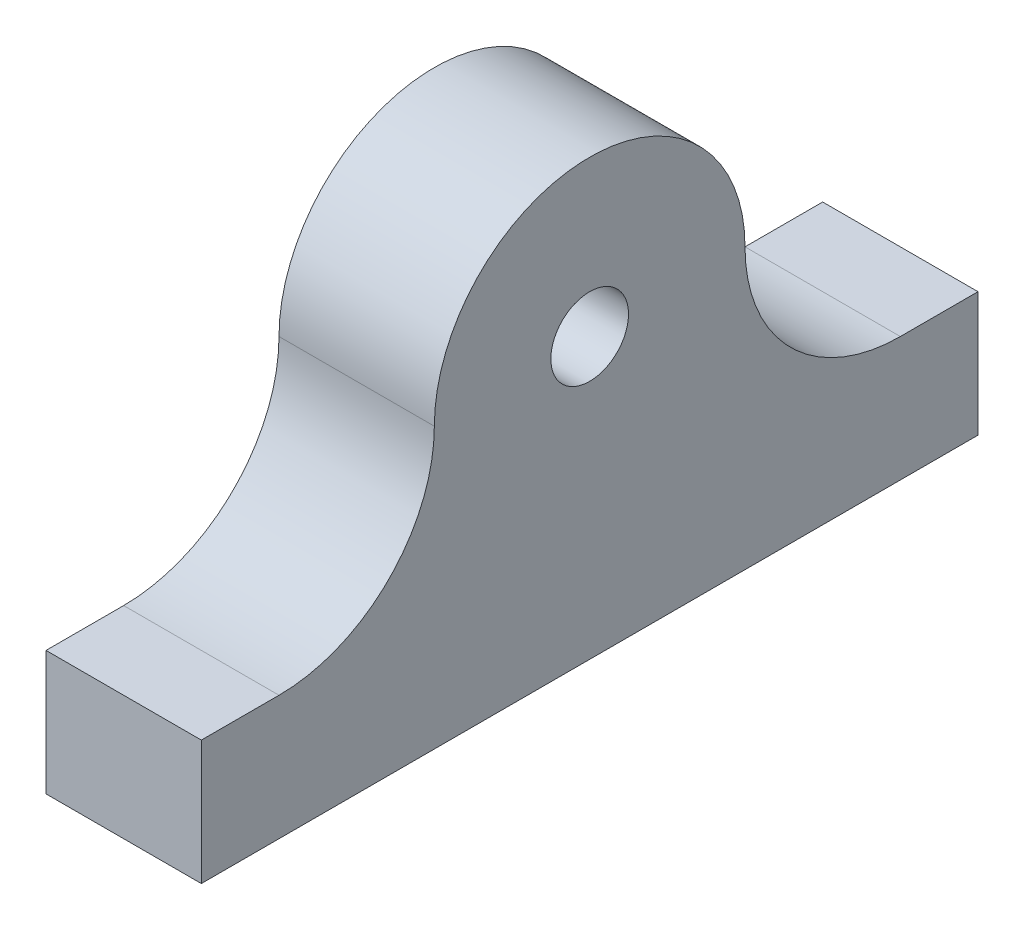
ISO-10303-21;
HEADER;
FILE_DESCRIPTION(('STEP AP214'),'2;1');
FILE_NAME('part.step','',(''),(''),'','','');
FILE_SCHEMA(('AUTOMOTIVE_DESIGN { 1 0 10303 214 1 1 1 1 }'));
ENDSEC;
DATA;
#1=APPLICATION_CONTEXT('core data for automotive mechanical design processes');
#2=APPLICATION_PROTOCOL_DEFINITION('international standard','automotive_design',2000,#1);
#3=PRODUCT_CONTEXT('',#1,'mechanical');
#4=PRODUCT('Part','Part','',(#3));
#5=PRODUCT_RELATED_PRODUCT_CATEGORY('part','',(#4));
#6=PRODUCT_DEFINITION_FORMATION('','',#4);
#7=PRODUCT_DEFINITION_CONTEXT('part definition',#1,'design');
#8=PRODUCT_DEFINITION('design','',#6,#7);
#9=PRODUCT_DEFINITION_SHAPE('','',#8);
#10=(LENGTH_UNIT() NAMED_UNIT(*) SI_UNIT(.MILLI.,.METRE.));
#11=(NAMED_UNIT(*) PLANE_ANGLE_UNIT() SI_UNIT($,.RADIAN.));
#12=(NAMED_UNIT(*) SI_UNIT($,.STERADIAN.) SOLID_ANGLE_UNIT());
#13=UNCERTAINTY_MEASURE_WITH_UNIT(LENGTH_MEASURE(1.E-05),#10,'distance_accuracy_value','');
#14=(GEOMETRIC_REPRESENTATION_CONTEXT(3) GLOBAL_UNCERTAINTY_ASSIGNED_CONTEXT((#13)) GLOBAL_UNIT_ASSIGNED_CONTEXT((#10,
#11,#12)) REPRESENTATION_CONTEXT('',''));
#15=CARTESIAN_POINT('',(0.,0.,0.));
#16=DIRECTION('',(0.,0.,1.));
#17=DIRECTION('',(1.,0.,0.));
#18=AXIS2_PLACEMENT_3D('',#15,#16,#17);
#19=CARTESIAN_POINT('',(10.,18.,0.));
#20=DIRECTION('',(1.,0.,0.));
#21=DIRECTION('',(0.,0.,-1.));
#22=AXIS2_PLACEMENT_3D('',#19,#20,#21);
#23=PLANE('',#22);
#24=DIRECTION('',(0.,-1.,0.));
#25=VECTOR('',#24,1.);
#26=CARTESIAN_POINT('',(10.,0.,25.));
#27=LINE('',#26,#25);
#28=CARTESIAN_POINT('',(10.,7.99999999999999,25.));
#29=VERTEX_POINT('',#28);
#30=CARTESIAN_POINT('',(10.,0.,25.));
#31=VERTEX_POINT('',#30);
#32=EDGE_CURVE('E111',#29,#31,#27,.T.);
#33=ORIENTED_EDGE('',*,*,#32,.T.);
#34=DIRECTION('',(0.,0.,-1.));
#35=VECTOR('',#34,1.);
#36=CARTESIAN_POINT('',(10.,0.,25.));
#37=LINE('',#36,#35);
#38=CARTESIAN_POINT('',(10.,0.,-25.));
#39=VERTEX_POINT('',#38);
#40=EDGE_CURVE('E101',#31,#39,#37,.T.);
#41=ORIENTED_EDGE('',*,*,#40,.T.);
#42=DIRECTION('',(0.,1.,0.));
#43=VECTOR('',#42,1.);
#44=CARTESIAN_POINT('',(10.,0.,-25.));
#45=LINE('',#44,#43);
#46=CARTESIAN_POINT('',(10.,8.,-25.));
#47=VERTEX_POINT('',#46);
#48=EDGE_CURVE('E110',#39,#47,#45,.T.);
#49=ORIENTED_EDGE('',*,*,#48,.T.);
#50=DIRECTION('',(0.,0.,1.));
#51=VECTOR('',#50,1.);
#52=CARTESIAN_POINT('',(10.,8.,-10.));
#53=LINE('',#52,#51);
#54=CARTESIAN_POINT('',(10.,8.,-20.));
#55=VERTEX_POINT('',#54);
#56=EDGE_CURVE('E167',#47,#55,#53,.T.);
#57=ORIENTED_EDGE('',*,*,#56,.T.);
#58=CARTESIAN_POINT('',(10.,18.,-20.));
#59=DIRECTION('',(1.,0.,0.));
#60=DIRECTION('',(0.,0.,-1.));
#61=AXIS2_PLACEMENT_3D('',#58,#59,#60);
#62=CIRCLE('',#61,10.);
#63=CARTESIAN_POINT('',(10.,18.,-10.));
#64=VERTEX_POINT('',#63);
#65=EDGE_CURVE('E135',#55,#64,#62,.F.);
#66=ORIENTED_EDGE('',*,*,#65,.T.);
#67=CARTESIAN_POINT('',(10.,18.,0.));
#68=DIRECTION('',(1.,0.,0.));
#69=DIRECTION('',(0.,0.,-1.));
#70=AXIS2_PLACEMENT_3D('',#67,#68,#69);
#71=CIRCLE('',#70,10.);
#72=CARTESIAN_POINT('',(10.,18.,10.));
#73=VERTEX_POINT('',#72);
#74=EDGE_CURVE('E184',#64,#73,#71,.T.);
#75=ORIENTED_EDGE('',*,*,#74,.T.);
#76=CARTESIAN_POINT('',(10.,18.,20.));
#77=DIRECTION('',(1.,0.,0.));
#78=DIRECTION('',(0.,0.,-1.));
#79=AXIS2_PLACEMENT_3D('',#76,#77,#78);
#80=CIRCLE('',#79,10.);
#81=CARTESIAN_POINT('',(10.,7.99999999999999,20.));
#82=VERTEX_POINT('',#81);
#83=EDGE_CURVE('E11',#73,#82,#80,.F.);
#84=ORIENTED_EDGE('',*,*,#83,.T.);
#85=DIRECTION('',(0.,0.,1.));
#86=VECTOR('',#85,1.);
#87=CARTESIAN_POINT('',(10.,7.99999999999999,25.));
#88=LINE('',#87,#86);
#89=EDGE_CURVE('E115',#82,#29,#88,.T.);
#90=ORIENTED_EDGE('',*,*,#89,.T.);
#91=EDGE_LOOP('',(#33,#41,#49,#57,#66,#75,#84,#90));
#92=FACE_BOUND('',#91,.T.);
#93=CARTESIAN_POINT('',(10.,18.,0.));
#94=DIRECTION('',(1.,0.,0.));
#95=DIRECTION('',(0.,0.,-1.));
#96=AXIS2_PLACEMENT_3D('',#93,#94,#95);
#97=CIRCLE('',#96,2.5);
#98=CARTESIAN_POINT('',(10.,18.,-2.5));
#99=VERTEX_POINT('',#98);
#100=EDGE_CURVE('E177',#99,#99,#97,.T.);
#101=ORIENTED_EDGE('',*,*,#100,.F.);
#102=EDGE_LOOP('',(#101));
#103=FACE_BOUND('',#102,.T.);
#104=ADVANCED_FACE('F38',(#92,#103),#23,.T.);
#105=CARTESIAN_POINT('',(0.,18.,0.));
#106=DIRECTION('',(1.,0.,0.));
#107=DIRECTION('',(0.,0.,-1.));
#108=AXIS2_PLACEMENT_3D('',#105,#106,#107);
#109=PLANE('',#108);
#110=DIRECTION('',(0.,-1.,0.));
#111=VECTOR('',#110,1.);
#112=CARTESIAN_POINT('',(0.,0.,25.));
#113=LINE('',#112,#111);
#114=CARTESIAN_POINT('',(0.,7.99999999999999,25.));
#115=VERTEX_POINT('',#114);
#116=CARTESIAN_POINT('',(0.,0.,25.));
#117=VERTEX_POINT('',#116);
#118=EDGE_CURVE('E123',#115,#117,#113,.T.);
#119=ORIENTED_EDGE('',*,*,#118,.F.);
#120=DIRECTION('',(0.,0.,1.));
#121=VECTOR('',#120,1.);
#122=CARTESIAN_POINT('',(0.,7.99999999999999,25.));
#123=LINE('',#122,#121);
#124=CARTESIAN_POINT('',(0.,7.99999999999999,20.));
#125=VERTEX_POINT('',#124);
#126=EDGE_CURVE('E119',#125,#115,#123,.T.);
#127=ORIENTED_EDGE('',*,*,#126,.F.);
#128=CARTESIAN_POINT('',(0.,18.,20.));
#129=DIRECTION('',(1.,0.,0.));
#130=DIRECTION('',(0.,0.,-1.));
#131=AXIS2_PLACEMENT_3D('',#128,#129,#130);
#132=CIRCLE('',#131,10.);
#133=CARTESIAN_POINT('',(0.,18.,10.));
#134=VERTEX_POINT('',#133);
#135=EDGE_CURVE('E46',#125,#134,#132,.T.);
#136=ORIENTED_EDGE('',*,*,#135,.T.);
#137=CARTESIAN_POINT('',(0.,18.,0.));
#138=DIRECTION('',(1.,0.,0.));
#139=DIRECTION('',(0.,0.,-1.));
#140=AXIS2_PLACEMENT_3D('',#137,#138,#139);
#141=CIRCLE('',#140,10.);
#142=CARTESIAN_POINT('',(0.,18.,-10.));
#143=VERTEX_POINT('',#142);
#144=EDGE_CURVE('E142',#143,#134,#141,.T.);
#145=ORIENTED_EDGE('',*,*,#144,.F.);
#146=CARTESIAN_POINT('',(0.,18.,-20.));
#147=DIRECTION('',(1.,0.,0.));
#148=DIRECTION('',(0.,0.,-1.));
#149=AXIS2_PLACEMENT_3D('',#146,#147,#148);
#150=CIRCLE('',#149,10.);
#151=CARTESIAN_POINT('',(0.,8.,-20.));
#152=VERTEX_POINT('',#151);
#153=EDGE_CURVE('E133',#143,#152,#150,.T.);
#154=ORIENTED_EDGE('',*,*,#153,.T.);
#155=DIRECTION('',(0.,0.,1.));
#156=VECTOR('',#155,1.);
#157=CARTESIAN_POINT('',(0.,8.,-10.));
#158=LINE('',#157,#156);
#159=CARTESIAN_POINT('',(0.,8.,-25.));
#160=VERTEX_POINT('',#159);
#161=EDGE_CURVE('E151',#160,#152,#158,.T.);
#162=ORIENTED_EDGE('',*,*,#161,.F.);
#163=DIRECTION('',(0.,1.,0.));
#164=VECTOR('',#163,1.);
#165=CARTESIAN_POINT('',(0.,0.,-25.));
#166=LINE('',#165,#164);
#167=CARTESIAN_POINT('',(0.,0.,-25.));
#168=VERTEX_POINT('',#167);
#169=EDGE_CURVE('E170',#168,#160,#166,.T.);
#170=ORIENTED_EDGE('',*,*,#169,.F.);
#171=DIRECTION('',(0.,0.,-1.));
#172=VECTOR('',#171,1.);
#173=CARTESIAN_POINT('',(0.,0.,25.));
#174=LINE('',#173,#172);
#175=EDGE_CURVE('E172',#117,#168,#174,.T.);
#176=ORIENTED_EDGE('',*,*,#175,.F.);
#177=EDGE_LOOP('',(#119,#127,#136,#145,#154,#162,#170,#176));
#178=FACE_BOUND('',#177,.T.);
#179=CARTESIAN_POINT('',(0.,18.,0.));
#180=DIRECTION('',(1.,0.,0.));
#181=DIRECTION('',(0.,0.,-1.));
#182=AXIS2_PLACEMENT_3D('',#179,#180,#181);
#183=CIRCLE('',#182,2.5);
#184=CARTESIAN_POINT('',(0.,18.,-2.5));
#185=VERTEX_POINT('',#184);
#186=EDGE_CURVE('E180',#185,#185,#183,.T.);
#187=ORIENTED_EDGE('',*,*,#186,.T.);
#188=EDGE_LOOP('',(#187));
#189=FACE_BOUND('',#188,.T.);
#190=ADVANCED_FACE('F140',(#178,#189),#109,.F.);
#191=CARTESIAN_POINT('',(10.,0.,25.));
#192=DIRECTION('',(0.,0.,-1.));
#193=DIRECTION('',(-1.,0.,0.));
#194=AXIS2_PLACEMENT_3D('',#191,#192,#193);
#195=PLANE('',#194);
#196=ORIENTED_EDGE('',*,*,#118,.T.);
#197=DIRECTION('',(-1.,0.,0.));
#198=VECTOR('',#197,1.);
#199=CARTESIAN_POINT('',(10.,0.,25.));
#200=LINE('',#199,#198);
#201=EDGE_CURVE('E105',#31,#117,#200,.T.);
#202=ORIENTED_EDGE('',*,*,#201,.F.);
#203=ORIENTED_EDGE('',*,*,#32,.F.);
#204=DIRECTION('',(-1.,0.,0.));
#205=VECTOR('',#204,1.);
#206=CARTESIAN_POINT('',(10.,7.99999999999999,25.));
#207=LINE('',#206,#205);
#208=EDGE_CURVE('E153',#29,#115,#207,.T.);
#209=ORIENTED_EDGE('',*,*,#208,.T.);
#210=EDGE_LOOP('',(#196,#202,#203,#209));
#211=FACE_BOUND('',#210,.T.);
#212=ADVANCED_FACE('F121',(#211),#195,.F.);
#213=CARTESIAN_POINT('',(10.,0.,25.));
#214=DIRECTION('',(0.,1.,0.));
#215=DIRECTION('',(0.,0.,1.));
#216=AXIS2_PLACEMENT_3D('',#213,#214,#215);
#217=PLANE('',#216);
#218=ORIENTED_EDGE('',*,*,#175,.T.);
#219=DIRECTION('',(-1.,0.,0.));
#220=VECTOR('',#219,1.);
#221=CARTESIAN_POINT('',(10.,0.,-25.));
#222=LINE('',#221,#220);
#223=EDGE_CURVE('E108',#39,#168,#222,.T.);
#224=ORIENTED_EDGE('',*,*,#223,.F.);
#225=ORIENTED_EDGE('',*,*,#40,.F.);
#226=ORIENTED_EDGE('',*,*,#201,.T.);
#227=EDGE_LOOP('',(#218,#224,#225,#226));
#228=FACE_BOUND('',#227,.T.);
#229=ADVANCED_FACE('F103',(#228),#217,.F.);
#230=CARTESIAN_POINT('',(10.,0.,-25.));
#231=DIRECTION('',(0.,0.,1.));
#232=DIRECTION('',(1.,0.,0.));
#233=AXIS2_PLACEMENT_3D('',#230,#231,#232);
#234=PLANE('',#233);
#235=ORIENTED_EDGE('',*,*,#169,.T.);
#236=DIRECTION('',(-1.,0.,0.));
#237=VECTOR('',#236,1.);
#238=CARTESIAN_POINT('',(10.,8.,-25.));
#239=LINE('',#238,#237);
#240=EDGE_CURVE('E128',#47,#160,#239,.T.);
#241=ORIENTED_EDGE('',*,*,#240,.F.);
#242=ORIENTED_EDGE('',*,*,#48,.F.);
#243=ORIENTED_EDGE('',*,*,#223,.T.);
#244=EDGE_LOOP('',(#235,#241,#242,#243));
#245=FACE_BOUND('',#244,.T.);
#246=ADVANCED_FACE('F213',(#245),#234,.F.);
#247=CARTESIAN_POINT('',(10.,8.,-10.));
#248=DIRECTION('',(0.,-1.,0.));
#249=DIRECTION('',(0.,0.,-1.));
#250=AXIS2_PLACEMENT_3D('',#247,#248,#249);
#251=PLANE('',#250);
#252=ORIENTED_EDGE('',*,*,#161,.T.);
#253=DIRECTION('',(-1.,0.,0.));
#254=VECTOR('',#253,1.);
#255=CARTESIAN_POINT('',(10.,8.,-20.));
#256=LINE('',#255,#254);
#257=EDGE_CURVE('E124',#152,#55,#256,.F.);
#258=ORIENTED_EDGE('',*,*,#257,.T.);
#259=ORIENTED_EDGE('',*,*,#56,.F.);
#260=ORIENTED_EDGE('',*,*,#240,.T.);
#261=EDGE_LOOP('',(#252,#258,#259,#260));
#262=FACE_BOUND('',#261,.T.);
#263=ADVANCED_FACE('F164',(#262),#251,.F.);
#264=CARTESIAN_POINT('',(10.,18.,0.));
#265=DIRECTION('',(-1.,0.,0.));
#266=DIRECTION('',(0.,0.,1.));
#267=AXIS2_PLACEMENT_3D('',#264,#265,#266);
#268=CYLINDRICAL_SURFACE('',#267,10.);
#269=ORIENTED_EDGE('',*,*,#144,.T.);
#270=DIRECTION('',(-1.,0.,0.));
#271=VECTOR('',#270,1.);
#272=CARTESIAN_POINT('',(10.,18.,10.));
#273=LINE('',#272,#271);
#274=EDGE_CURVE('E148',#73,#134,#273,.T.);
#275=ORIENTED_EDGE('',*,*,#274,.F.);
#276=ORIENTED_EDGE('',*,*,#74,.F.);
#277=DIRECTION('',(-1.,0.,0.));
#278=VECTOR('',#277,1.);
#279=CARTESIAN_POINT('',(10.,18.,-10.));
#280=LINE('',#279,#278);
#281=EDGE_CURVE('E150',#64,#143,#280,.T.);
#282=ORIENTED_EDGE('',*,*,#281,.T.);
#283=EDGE_LOOP('',(#269,#275,#276,#282));
#284=FACE_BOUND('',#283,.T.);
#285=ADVANCED_FACE('F146',(#284),#268,.T.);
#286=CARTESIAN_POINT('',(10.,7.99999999999999,25.));
#287=DIRECTION('',(0.,-1.,0.));
#288=DIRECTION('',(0.,0.,-1.));
#289=AXIS2_PLACEMENT_3D('',#286,#287,#288);
#290=PLANE('',#289);
#291=ORIENTED_EDGE('',*,*,#89,.F.);
#292=DIRECTION('',(-1.,0.,0.));
#293=VECTOR('',#292,1.);
#294=CARTESIAN_POINT('',(0.,7.99999999999999,20.));
#295=LINE('',#294,#293);
#296=EDGE_CURVE('E126',#82,#125,#295,.T.);
#297=ORIENTED_EDGE('',*,*,#296,.T.);
#298=ORIENTED_EDGE('',*,*,#126,.T.);
#299=ORIENTED_EDGE('',*,*,#208,.F.);
#300=EDGE_LOOP('',(#291,#297,#298,#299));
#301=FACE_BOUND('',#300,.T.);
#302=ADVANCED_FACE('F176',(#301),#290,.F.);
#303=CARTESIAN_POINT('',(10.,18.,0.));
#304=DIRECTION('',(-1.,0.,0.));
#305=DIRECTION('',(0.,0.,1.));
#306=AXIS2_PLACEMENT_3D('',#303,#304,#305);
#307=CYLINDRICAL_SURFACE('',#306,2.5);
#308=ORIENTED_EDGE('',*,*,#100,.T.);
#309=EDGE_LOOP('',(#308));
#310=FACE_BOUND('',#309,.T.);
#311=ORIENTED_EDGE('',*,*,#186,.F.);
#312=EDGE_LOOP('',(#311));
#313=FACE_BOUND('',#312,.T.);
#314=ADVANCED_FACE('F191',(#310,#313),#307,.F.);
#315=CARTESIAN_POINT('',(10.,18.,-20.));
#316=DIRECTION('',(1.,0.,0.));
#317=DIRECTION('',(0.,0.,-1.));
#318=AXIS2_PLACEMENT_3D('',#315,#316,#317);
#319=CYLINDRICAL_SURFACE('',#318,10.);
#320=ORIENTED_EDGE('',*,*,#65,.F.);
#321=ORIENTED_EDGE('',*,*,#257,.F.);
#322=ORIENTED_EDGE('',*,*,#153,.F.);
#323=ORIENTED_EDGE('',*,*,#281,.F.);
#324=EDGE_LOOP('',(#320,#321,#322,#323));
#325=FACE_BOUND('',#324,.T.);
#326=ADVANCED_FACE('F193',(#325),#319,.F.);
#327=CARTESIAN_POINT('',(10.,18.,20.));
#328=DIRECTION('',(1.,0.,0.));
#329=DIRECTION('',(0.,0.,-1.));
#330=AXIS2_PLACEMENT_3D('',#327,#328,#329);
#331=CYLINDRICAL_SURFACE('',#330,10.);
#332=ORIENTED_EDGE('',*,*,#83,.F.);
#333=ORIENTED_EDGE('',*,*,#274,.T.);
#334=ORIENTED_EDGE('',*,*,#135,.F.);
#335=ORIENTED_EDGE('',*,*,#296,.F.);
#336=EDGE_LOOP('',(#332,#333,#334,#335));
#337=FACE_BOUND('',#336,.T.);
#338=ADVANCED_FACE('F40',(#337),#331,.F.);
#339=CLOSED_SHELL('',(#104,#190,#212,#229,#246,#263,#285,#302,#314,#326,#338));
#340=MANIFOLD_SOLID_BREP('B2',#339);
#341=ADVANCED_BREP_SHAPE_REPRESENTATION('',(#18,#340),#14);
#342=SHAPE_DEFINITION_REPRESENTATION(#9,#341);
ENDSEC;
END-ISO-10303-21;
